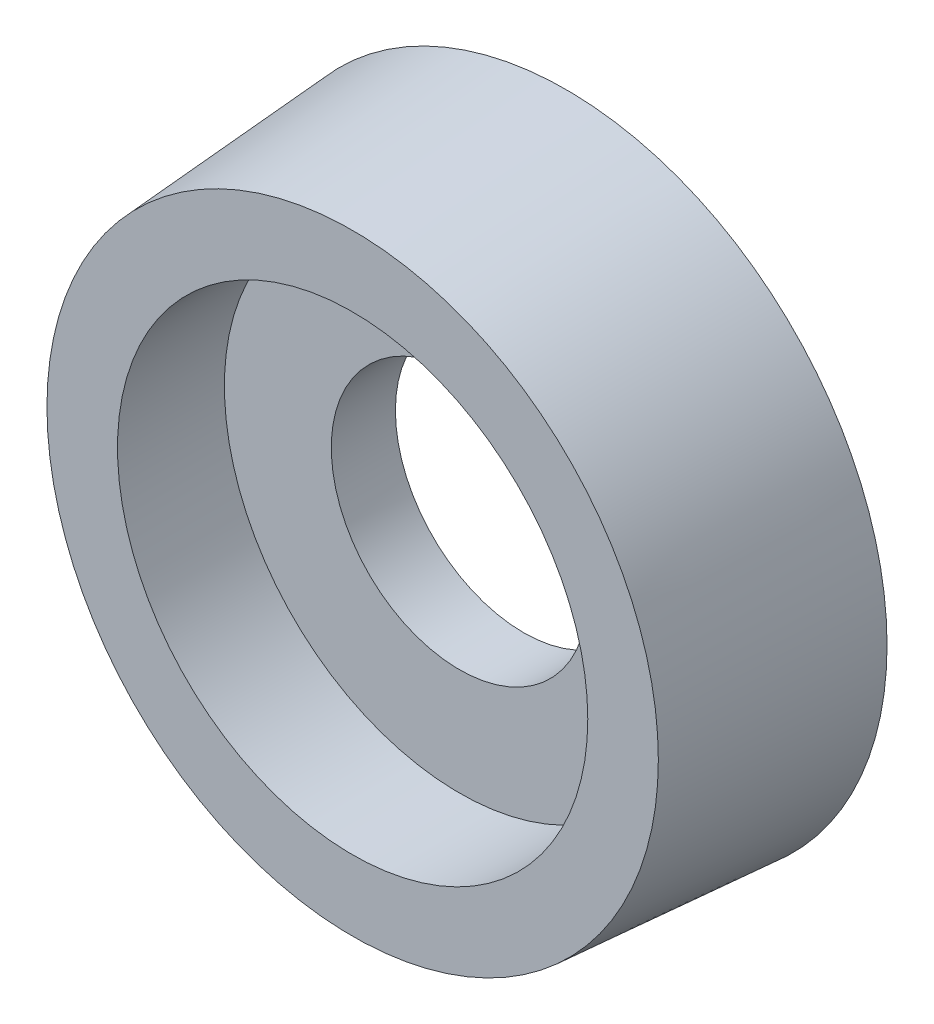
ISO-10303-21;
HEADER;
FILE_DESCRIPTION(('STEP AP214'),'2;1');
FILE_NAME('part.step','',(''),(''),'','','');
FILE_SCHEMA(('AUTOMOTIVE_DESIGN { 1 0 10303 214 1 1 1 1 }'));
ENDSEC;
DATA;
#1=APPLICATION_CONTEXT('core data for automotive mechanical design processes');
#2=APPLICATION_PROTOCOL_DEFINITION('international standard','automotive_design',2000,#1);
#3=PRODUCT_CONTEXT('',#1,'mechanical');
#4=PRODUCT('Part','Part','',(#3));
#5=PRODUCT_RELATED_PRODUCT_CATEGORY('part','',(#4));
#6=PRODUCT_DEFINITION_FORMATION('','',#4);
#7=PRODUCT_DEFINITION_CONTEXT('part definition',#1,'design');
#8=PRODUCT_DEFINITION('design','',#6,#7);
#9=PRODUCT_DEFINITION_SHAPE('','',#8);
#10=(LENGTH_UNIT() NAMED_UNIT(*) SI_UNIT(.MILLI.,.METRE.));
#11=(NAMED_UNIT(*) PLANE_ANGLE_UNIT() SI_UNIT($,.RADIAN.));
#12=(NAMED_UNIT(*) SI_UNIT($,.STERADIAN.) SOLID_ANGLE_UNIT());
#13=UNCERTAINTY_MEASURE_WITH_UNIT(LENGTH_MEASURE(1.E-05),#10,'distance_accuracy_value','');
#14=(GEOMETRIC_REPRESENTATION_CONTEXT(3) GLOBAL_UNCERTAINTY_ASSIGNED_CONTEXT((#13)) GLOBAL_UNIT_ASSIGNED_CONTEXT((#10,
#11,#12)) REPRESENTATION_CONTEXT('',''));
#15=CARTESIAN_POINT('',(0.,0.,0.));
#16=DIRECTION('',(0.,0.,1.));
#17=DIRECTION('',(1.,0.,0.));
#18=AXIS2_PLACEMENT_3D('',#15,#16,#17);
#19=CARTESIAN_POINT('',(0.,0.,0.));
#20=DIRECTION('',(0.,0.,-1.));
#21=DIRECTION('',(1.,0.,0.));
#22=AXIS2_PLACEMENT_3D('',#19,#20,#21);
#23=CONICAL_SURFACE('',#22,7.5,0.0698131700797732);
#24=CARTESIAN_POINT('',(0.,0.,5.));
#25=DIRECTION('',(0.,0.,1.));
#26=DIRECTION('',(1.,0.,0.));
#27=AXIS2_PLACEMENT_3D('',#24,#25,#26);
#28=CIRCLE('',#27,7.15036594028245);
#29=CARTESIAN_POINT('',(7.15036594028245,0.,5.));
#30=VERTEX_POINT('',#29);
#31=EDGE_CURVE('E10',#30,#30,#28,.T.);
#32=ORIENTED_EDGE('',*,*,#31,.F.);
#33=EDGE_LOOP('',(#32));
#34=FACE_BOUND('',#33,.T.);
#35=CARTESIAN_POINT('',(0.,0.,0.));
#36=DIRECTION('',(0.,0.,1.));
#37=DIRECTION('',(1.,0.,0.));
#38=AXIS2_PLACEMENT_3D('',#35,#36,#37);
#39=CIRCLE('',#38,7.5);
#40=CARTESIAN_POINT('',(7.5,0.,0.));
#41=VERTEX_POINT('',#40);
#42=EDGE_CURVE('E45',#41,#41,#39,.T.);
#43=ORIENTED_EDGE('',*,*,#42,.T.);
#44=EDGE_LOOP('',(#43));
#45=FACE_BOUND('',#44,.T.);
#46=ADVANCED_FACE('F37',(#34,#45),#23,.T.);
#47=CARTESIAN_POINT('',(0.,0.,5.));
#48=DIRECTION('',(0.,0.,1.));
#49=DIRECTION('',(1.,0.,0.));
#50=AXIS2_PLACEMENT_3D('',#47,#48,#49);
#51=PLANE('',#50);
#52=CARTESIAN_POINT('',(0.,0.,5.));
#53=DIRECTION('',(0.,0.,1.));
#54=DIRECTION('',(1.,0.,0.));
#55=AXIS2_PLACEMENT_3D('',#52,#53,#54);
#56=CIRCLE('',#55,5.5);
#57=CARTESIAN_POINT('',(5.5,0.,5.));
#58=VERTEX_POINT('',#57);
#59=EDGE_CURVE('E61',#58,#58,#56,.T.);
#60=ORIENTED_EDGE('',*,*,#59,.F.);
#61=EDGE_LOOP('',(#60));
#62=FACE_BOUND('',#61,.T.);
#63=ORIENTED_EDGE('',*,*,#31,.T.);
#64=EDGE_LOOP('',(#63));
#65=FACE_BOUND('',#64,.T.);
#66=ADVANCED_FACE('F92',(#62,#65),#51,.T.);
#67=CARTESIAN_POINT('',(0.,0.,0.));
#68=DIRECTION('',(0.,0.,1.));
#69=DIRECTION('',(1.,0.,0.));
#70=AXIS2_PLACEMENT_3D('',#67,#68,#69);
#71=PLANE('',#70);
#72=CARTESIAN_POINT('',(0.,0.,0.));
#73=DIRECTION('',(0.,0.,-1.));
#74=DIRECTION('',(-1.,0.,0.));
#75=AXIS2_PLACEMENT_3D('',#72,#73,#74);
#76=CIRCLE('',#75,5.);
#77=CARTESIAN_POINT('',(-5.,0.,0.));
#78=VERTEX_POINT('',#77);
#79=EDGE_CURVE('E53',#78,#78,#76,.T.);
#80=ORIENTED_EDGE('',*,*,#79,.F.);
#81=EDGE_LOOP('',(#80));
#82=FACE_BOUND('',#81,.T.);
#83=ORIENTED_EDGE('',*,*,#42,.F.);
#84=EDGE_LOOP('',(#83));
#85=FACE_BOUND('',#84,.T.);
#86=ADVANCED_FACE('F94',(#82,#85),#71,.F.);
#87=CARTESIAN_POINT('',(0.,0.,1.));
#88=DIRECTION('',(0.,0.,-1.));
#89=DIRECTION('',(-1.,0.,0.));
#90=AXIS2_PLACEMENT_3D('',#87,#88,#89);
#91=CYLINDRICAL_SURFACE('',#90,5.);
#92=CARTESIAN_POINT('',(0.,0.,1.));
#93=DIRECTION('',(0.,0.,-1.));
#94=DIRECTION('',(-1.,0.,0.));
#95=AXIS2_PLACEMENT_3D('',#92,#93,#94);
#96=CIRCLE('',#95,5.);
#97=CARTESIAN_POINT('',(-5.,0.,1.));
#98=VERTEX_POINT('',#97);
#99=EDGE_CURVE('E50',#98,#98,#96,.T.);
#100=ORIENTED_EDGE('',*,*,#99,.F.);
#101=EDGE_LOOP('',(#100));
#102=FACE_BOUND('',#101,.T.);
#103=ORIENTED_EDGE('',*,*,#79,.T.);
#104=EDGE_LOOP('',(#103));
#105=FACE_BOUND('',#104,.T.);
#106=ADVANCED_FACE('F100',(#102,#105),#91,.F.);
#107=CARTESIAN_POINT('',(0.,0.,1.));
#108=DIRECTION('',(0.,0.,-1.));
#109=DIRECTION('',(-1.,0.,0.));
#110=AXIS2_PLACEMENT_3D('',#107,#108,#109);
#111=PLANE('',#110);
#112=CARTESIAN_POINT('',(0.,0.,1.));
#113=DIRECTION('',(0.,0.,-1.));
#114=DIRECTION('',(-1.,0.,0.));
#115=AXIS2_PLACEMENT_3D('',#112,#113,#114);
#116=CIRCLE('',#115,3.);
#117=CARTESIAN_POINT('',(-3.,0.,1.));
#118=VERTEX_POINT('',#117);
#119=EDGE_CURVE('E65',#118,#118,#116,.T.);
#120=ORIENTED_EDGE('',*,*,#119,.F.);
#121=EDGE_LOOP('',(#120));
#122=FACE_BOUND('',#121,.T.);
#123=ORIENTED_EDGE('',*,*,#99,.T.);
#124=EDGE_LOOP('',(#123));
#125=FACE_BOUND('',#124,.T.);
#126=ADVANCED_FACE('F88',(#122,#125),#111,.T.);
#127=CARTESIAN_POINT('',(0.,0.,2.5));
#128=DIRECTION('',(0.,0.,1.));
#129=DIRECTION('',(1.,0.,0.));
#130=AXIS2_PLACEMENT_3D('',#127,#128,#129);
#131=CYLINDRICAL_SURFACE('',#130,5.5);
#132=CARTESIAN_POINT('',(0.,0.,2.5));
#133=DIRECTION('',(0.,0.,1.));
#134=DIRECTION('',(1.,0.,0.));
#135=AXIS2_PLACEMENT_3D('',#132,#133,#134);
#136=CIRCLE('',#135,5.5);
#137=CARTESIAN_POINT('',(5.5,0.,2.5));
#138=VERTEX_POINT('',#137);
#139=EDGE_CURVE('E57',#138,#138,#136,.T.);
#140=ORIENTED_EDGE('',*,*,#139,.F.);
#141=EDGE_LOOP('',(#140));
#142=FACE_BOUND('',#141,.T.);
#143=ORIENTED_EDGE('',*,*,#59,.T.);
#144=EDGE_LOOP('',(#143));
#145=FACE_BOUND('',#144,.T.);
#146=ADVANCED_FACE('F82',(#142,#145),#131,.F.);
#147=CARTESIAN_POINT('',(0.,0.,2.5));
#148=DIRECTION('',(0.,0.,1.));
#149=DIRECTION('',(1.,0.,0.));
#150=AXIS2_PLACEMENT_3D('',#147,#148,#149);
#151=PLANE('',#150);
#152=CARTESIAN_POINT('',(0.,0.,2.5));
#153=DIRECTION('',(0.,0.,1.));
#154=DIRECTION('',(1.,0.,0.));
#155=AXIS2_PLACEMENT_3D('',#152,#153,#154);
#156=CIRCLE('',#155,3.);
#157=CARTESIAN_POINT('',(3.,0.,2.5));
#158=VERTEX_POINT('',#157);
#159=EDGE_CURVE('E40',#158,#158,#156,.T.);
#160=ORIENTED_EDGE('',*,*,#159,.F.);
#161=EDGE_LOOP('',(#160));
#162=FACE_BOUND('',#161,.T.);
#163=ORIENTED_EDGE('',*,*,#139,.T.);
#164=EDGE_LOOP('',(#163));
#165=FACE_BOUND('',#164,.T.);
#166=ADVANCED_FACE('F79',(#162,#165),#151,.T.);
#167=CARTESIAN_POINT('',(0.,0.,0.));
#168=DIRECTION('',(0.,0.,1.));
#169=DIRECTION('',(1.,0.,0.));
#170=AXIS2_PLACEMENT_3D('',#167,#168,#169);
#171=CYLINDRICAL_SURFACE('',#170,3.);
#172=ORIENTED_EDGE('',*,*,#119,.T.);
#173=EDGE_LOOP('',(#172));
#174=FACE_BOUND('',#173,.T.);
#175=ORIENTED_EDGE('',*,*,#159,.T.);
#176=EDGE_LOOP('',(#175));
#177=FACE_BOUND('',#176,.T.);
#178=ADVANCED_FACE('F77',(#174,#177),#171,.F.);
#179=CLOSED_SHELL('',(#46,#66,#86,#106,#126,#146,#166,#178));
#180=MANIFOLD_SOLID_BREP('B2',#179);
#181=ADVANCED_BREP_SHAPE_REPRESENTATION('',(#18,#180),#14);
#182=SHAPE_DEFINITION_REPRESENTATION(#9,#181);
ENDSEC;
END-ISO-10303-21;
